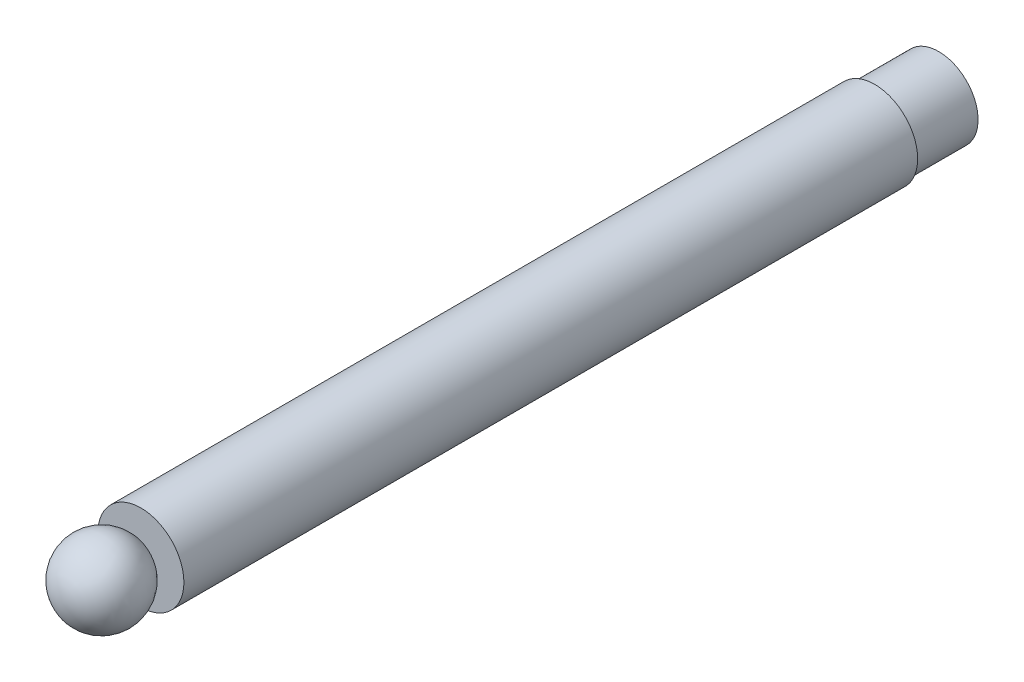
ISO-10303-21;
HEADER;
FILE_DESCRIPTION(('STEP AP214'),'2;1');
FILE_NAME('part.step','',(''),(''),'','','');
FILE_SCHEMA(('AUTOMOTIVE_DESIGN { 1 0 10303 214 1 1 1 1 }'));
ENDSEC;
DATA;
#1=APPLICATION_CONTEXT('core data for automotive mechanical design processes');
#2=APPLICATION_PROTOCOL_DEFINITION('international standard','automotive_design',2000,#1);
#3=PRODUCT_CONTEXT('',#1,'mechanical');
#4=PRODUCT('Part','Part','',(#3));
#5=PRODUCT_RELATED_PRODUCT_CATEGORY('part','',(#4));
#6=PRODUCT_DEFINITION_FORMATION('','',#4);
#7=PRODUCT_DEFINITION_CONTEXT('part definition',#1,'design');
#8=PRODUCT_DEFINITION('design','',#6,#7);
#9=PRODUCT_DEFINITION_SHAPE('','',#8);
#10=(LENGTH_UNIT() NAMED_UNIT(*) SI_UNIT(.MILLI.,.METRE.));
#11=(NAMED_UNIT(*) PLANE_ANGLE_UNIT() SI_UNIT($,.RADIAN.));
#12=(NAMED_UNIT(*) SI_UNIT($,.STERADIAN.) SOLID_ANGLE_UNIT());
#13=UNCERTAINTY_MEASURE_WITH_UNIT(LENGTH_MEASURE(1.E-05),#10,'distance_accuracy_value','');
#14=(GEOMETRIC_REPRESENTATION_CONTEXT(3) GLOBAL_UNCERTAINTY_ASSIGNED_CONTEXT((#13)) GLOBAL_UNIT_ASSIGNED_CONTEXT((#10,
#11,#12)) REPRESENTATION_CONTEXT('',''));
#15=CARTESIAN_POINT('',(0.,0.,0.));
#16=DIRECTION('',(0.,0.,1.));
#17=DIRECTION('',(1.,0.,0.));
#18=AXIS2_PLACEMENT_3D('',#15,#16,#17);
#19=CARTESIAN_POINT('',(0.,0.,170.));
#20=DIRECTION('',(0.,0.,-1.));
#21=DIRECTION('',(1.,0.,0.));
#22=AXIS2_PLACEMENT_3D('',#19,#20,#21);
#23=SPHERICAL_SURFACE('',#22,8.00000000000001);
#24=CARTESIAN_POINT('',(0.,0.,162.));
#25=VERTEX_POINT('',#24);
#26=VERTEX_LOOP('',#25);
#27=FACE_BOUND('',#26,.T.);
#28=ADVANCED_FACE('F45',(#27),#23,.T.);
#29=CLOSED_SHELL('',(#28));
#30=MANIFOLD_SOLID_BREP('B2',#29);
#31=CARTESIAN_POINT('',(0.,0.,13.));
#32=DIRECTION('',(0.,0.,-1.));
#33=DIRECTION('',(-1.,0.,0.));
#34=AXIS2_PLACEMENT_3D('',#31,#32,#33);
#35=CYLINDRICAL_SURFACE('',#34,8.);
#36=CARTESIAN_POINT('',(0.,0.,13.));
#37=DIRECTION('',(0.,0.,1.));
#38=DIRECTION('',(1.,0.,0.));
#39=AXIS2_PLACEMENT_3D('',#36,#37,#38);
#40=CIRCLE('',#39,8.);
#41=CARTESIAN_POINT('',(-8.,0.,13.));
#42=VERTEX_POINT('',#41);
#43=EDGE_CURVE('E43',#42,#42,#40,.T.);
#44=CARTESIAN_POINT('',(0.,0.,0.));
#45=DIRECTION('',(0.,0.,1.));
#46=DIRECTION('',(1.,0.,0.));
#47=AXIS2_PLACEMENT_3D('',#44,#45,#46);
#48=CIRCLE('',#47,8.);
#49=CARTESIAN_POINT('',(-8.,0.,0.));
#50=VERTEX_POINT('',#49);
#51=EDGE_CURVE('E61',#50,#50,#48,.T.);
#52=CARTESIAN_POINT('',(-8.,0.,13.));
#53=CARTESIAN_POINT('',(-8.,0.,12.8645833333333));
#54=CARTESIAN_POINT('',(-8.,0.,12.7291666666667));
#55=CARTESIAN_POINT('',(-8.,0.,12.4583333333333));
#56=CARTESIAN_POINT('',(-8.,0.,12.3229166666667));
#57=CARTESIAN_POINT('',(-8.,0.,12.0520833333333));
#58=CARTESIAN_POINT('',(-8.,0.,11.9166666666667));
#59=CARTESIAN_POINT('',(-8.,0.,11.6458333333333));
#60=CARTESIAN_POINT('',(-8.,0.,11.5104166666667));
#61=CARTESIAN_POINT('',(-8.,0.,11.2395833333333));
#62=CARTESIAN_POINT('',(-8.,0.,11.1041666666667));
#63=CARTESIAN_POINT('',(-8.,0.,10.8333333333333));
#64=CARTESIAN_POINT('',(-8.,0.,10.6979166666667));
#65=CARTESIAN_POINT('',(-8.,0.,10.4270833333333));
#66=CARTESIAN_POINT('',(-8.,0.,10.2916666666667));
#67=CARTESIAN_POINT('',(-8.,0.,10.0208333333333));
#68=CARTESIAN_POINT('',(-8.,0.,9.88541666666667));
#69=CARTESIAN_POINT('',(-8.,0.,9.61458333333333));
#70=CARTESIAN_POINT('',(-8.,0.,9.47916666666667));
#71=CARTESIAN_POINT('',(-8.,0.,9.20833333333333));
#72=CARTESIAN_POINT('',(-8.,0.,9.07291666666666));
#73=CARTESIAN_POINT('',(-8.,0.,8.80208333333333));
#74=CARTESIAN_POINT('',(-8.,0.,8.66666666666667));
#75=CARTESIAN_POINT('',(-8.,0.,8.39583333333333));
#76=CARTESIAN_POINT('',(-8.,0.,8.26041666666667));
#77=CARTESIAN_POINT('',(-8.,0.,7.98958333333333));
#78=CARTESIAN_POINT('',(-8.,0.,7.85416666666667));
#79=CARTESIAN_POINT('',(-8.,0.,7.58333333333333));
#80=CARTESIAN_POINT('',(-8.,0.,7.44791666666667));
#81=CARTESIAN_POINT('',(-8.,0.,7.17708333333333));
#82=CARTESIAN_POINT('',(-8.,0.,7.04166666666667));
#83=CARTESIAN_POINT('',(-8.,0.,6.77083333333333));
#84=CARTESIAN_POINT('',(-8.,0.,6.63541666666667));
#85=CARTESIAN_POINT('',(-8.,0.,6.36458333333333));
#86=CARTESIAN_POINT('',(-8.,0.,6.22916666666667));
#87=CARTESIAN_POINT('',(-8.,0.,5.95833333333333));
#88=CARTESIAN_POINT('',(-8.,0.,5.82291666666667));
#89=CARTESIAN_POINT('',(-8.,0.,5.55208333333333));
#90=CARTESIAN_POINT('',(-8.,0.,5.41666666666667));
#91=CARTESIAN_POINT('',(-8.,0.,5.14583333333333));
#92=CARTESIAN_POINT('',(-8.,0.,5.01041666666667));
#93=CARTESIAN_POINT('',(-8.,0.,4.73958333333333));
#94=CARTESIAN_POINT('',(-8.,0.,4.60416666666667));
#95=CARTESIAN_POINT('',(-8.,0.,4.33333333333333));
#96=CARTESIAN_POINT('',(-8.,0.,4.19791666666667));
#97=CARTESIAN_POINT('',(-8.,0.,3.92708333333333));
#98=CARTESIAN_POINT('',(-8.,0.,3.79166666666667));
#99=CARTESIAN_POINT('',(-8.,0.,3.52083333333333));
#100=CARTESIAN_POINT('',(-8.,0.,3.38541666666667));
#101=CARTESIAN_POINT('',(-8.,0.,3.11458333333333));
#102=CARTESIAN_POINT('',(-8.,0.,2.97916666666667));
#103=CARTESIAN_POINT('',(-8.,0.,2.70833333333333));
#104=CARTESIAN_POINT('',(-8.,0.,2.57291666666667));
#105=CARTESIAN_POINT('',(-8.,0.,2.30208333333333));
#106=CARTESIAN_POINT('',(-8.,0.,2.16666666666667));
#107=CARTESIAN_POINT('',(-8.,0.,1.89583333333333));
#108=CARTESIAN_POINT('',(-8.,0.,1.76041666666667));
#109=CARTESIAN_POINT('',(-8.,0.,1.48958333333333));
#110=CARTESIAN_POINT('',(-8.,0.,1.35416666666667));
#111=CARTESIAN_POINT('',(-8.,0.,1.08333333333333));
#112=CARTESIAN_POINT('',(-8.,0.,0.947916666666667));
#113=CARTESIAN_POINT('',(-8.,0.,0.677083333333334));
#114=CARTESIAN_POINT('',(-8.,0.,0.541666666666667));
#115=CARTESIAN_POINT('',(-8.,0.,0.270833333333334));
#116=CARTESIAN_POINT('',(-8.,0.,0.135416666666667));
#117=CARTESIAN_POINT('',(-8.,0.,0.));
#118=B_SPLINE_CURVE_WITH_KNOTS('',3,(#52,#53,#54,#55,#56,#57,#58,#59,#60,#61,#62,#63,#64,#65,
#66,#67,#68,#69,#70,#71,#72,#73,#74,#75,#76,#77,#78,#79,#80,#81,#82,#83,#84,#85,#86,#87,#88,#89,
#90,#91,#92,#93,#94,#95,#96,#97,#98,#99,#100,#101,#102,#103,#104,#105,#106,#107,#108,#109,#110,
#111,#112,#113,#114,#115,#116,#117),.UNSPECIFIED.,.F.,.F.,(4,2,2,2,2,2,2,2,2,2,2,2,2,2,2,2,2,2,
2,2,2,2,2,2,2,2,2,2,2,2,2,2,4),(0.,0.40625,0.812500000000001,1.21875,1.625,2.03125,2.4375,
2.84375,3.25,3.65625,4.0625,4.46875,4.875,5.28125,5.6875,6.09375,6.5,6.90625,7.3125,7.71875,
8.125,8.53125,8.9375,9.34375,9.75,10.15625,10.5625,10.96875,11.375,11.78125,12.1875,12.59375,
13.),.UNSPECIFIED.);
#119=EDGE_CURVE('BSEAM58',#42,#50,#118,.T.);
#120=ORIENTED_EDGE('',*,*,#43,.F.);
#121=ORIENTED_EDGE('',*,*,#51,.T.);
#122=ORIENTED_EDGE('',*,*,#119,.T.);
#123=ORIENTED_EDGE('',*,*,#119,.F.);
#124=EDGE_LOOP('',(#120,#122,#121,#123));
#125=FACE_BOUND('',#124,.T.);
#126=ADVANCED_FACE('F58',(#125),#35,.T.);
#127=CARTESIAN_POINT('',(0.,0.,0.));
#128=DIRECTION('',(0.,0.,1.));
#129=DIRECTION('',(1.,0.,0.));
#130=AXIS2_PLACEMENT_3D('',#127,#128,#129);
#131=PLANE('',#130);
#132=ORIENTED_EDGE('',*,*,#51,.F.);
#133=EDGE_LOOP('',(#132));
#134=FACE_BOUND('',#133,.T.);
#135=ADVANCED_FACE('F96',(#134),#131,.F.);
#136=CARTESIAN_POINT('',(0.,0.,162.));
#137=DIRECTION('',(0.,0.,-1.));
#138=DIRECTION('',(-1.,0.,0.));
#139=AXIS2_PLACEMENT_3D('',#136,#137,#138);
#140=CYLINDRICAL_SURFACE('',#139,8.733340629421);
#141=CARTESIAN_POINT('',(0.,0.,162.));
#142=DIRECTION('',(0.,0.,1.));
#143=DIRECTION('',(1.,0.,0.));
#144=AXIS2_PLACEMENT_3D('',#141,#142,#143);
#145=CIRCLE('',#144,8.733340629421);
#146=CARTESIAN_POINT('',(8.733340629421,0.,162.));
#147=VERTEX_POINT('',#146);
#148=EDGE_CURVE('E76',#147,#147,#145,.T.);
#149=ORIENTED_EDGE('',*,*,#148,.F.);
#150=EDGE_LOOP('',(#149));
#151=FACE_BOUND('',#150,.T.);
#152=CARTESIAN_POINT('',(0.,0.,13.));
#153=DIRECTION('',(0.,0.,1.));
#154=DIRECTION('',(1.,0.,0.));
#155=AXIS2_PLACEMENT_3D('',#152,#153,#154);
#156=CIRCLE('',#155,8.733340629421);
#157=CARTESIAN_POINT('',(8.733340629421,0.,13.));
#158=VERTEX_POINT('',#157);
#159=EDGE_CURVE('E79',#158,#158,#156,.T.);
#160=ORIENTED_EDGE('',*,*,#159,.T.);
#161=EDGE_LOOP('',(#160));
#162=FACE_BOUND('',#161,.T.);
#163=ADVANCED_FACE('F72',(#151,#162),#140,.T.);
#164=CARTESIAN_POINT('',(0.,0.,162.));
#165=DIRECTION('',(0.,0.,1.));
#166=DIRECTION('',(1.,0.,0.));
#167=AXIS2_PLACEMENT_3D('',#164,#165,#166);
#168=PLANE('',#167);
#169=CARTESIAN_POINT('',(0.,0.,162.));
#170=VERTEX_POINT('',#169);
#171=VERTEX_LOOP('',#170);
#172=FACE_BOUND('',#171,.T.);
#173=ORIENTED_EDGE('',*,*,#148,.T.);
#174=EDGE_LOOP('',(#173));
#175=FACE_BOUND('',#174,.T.);
#176=ADVANCED_FACE('F68',(#172,#175),#168,.T.);
#177=CARTESIAN_POINT('',(0.,0.,13.));
#178=DIRECTION('',(0.,0.,1.));
#179=DIRECTION('',(1.,0.,0.));
#180=AXIS2_PLACEMENT_3D('',#177,#178,#179);
#181=PLANE('',#180);
#182=ORIENTED_EDGE('',*,*,#43,.T.);
#183=EDGE_LOOP('',(#182));
#184=FACE_BOUND('',#183,.T.);
#185=ORIENTED_EDGE('',*,*,#159,.F.);
#186=EDGE_LOOP('',(#185));
#187=FACE_BOUND('',#186,.T.);
#188=ADVANCED_FACE('F71',(#184,#187),#181,.F.);
#189=CLOSED_SHELL('',(#126,#135,#163,#176,#188));
#190=MANIFOLD_SOLID_BREP('B6',#189);
#191=ADVANCED_BREP_SHAPE_REPRESENTATION('',(#18,#30,#190),#14);
#192=SHAPE_DEFINITION_REPRESENTATION(#9,#191);
ENDSEC;
END-ISO-10303-21;
